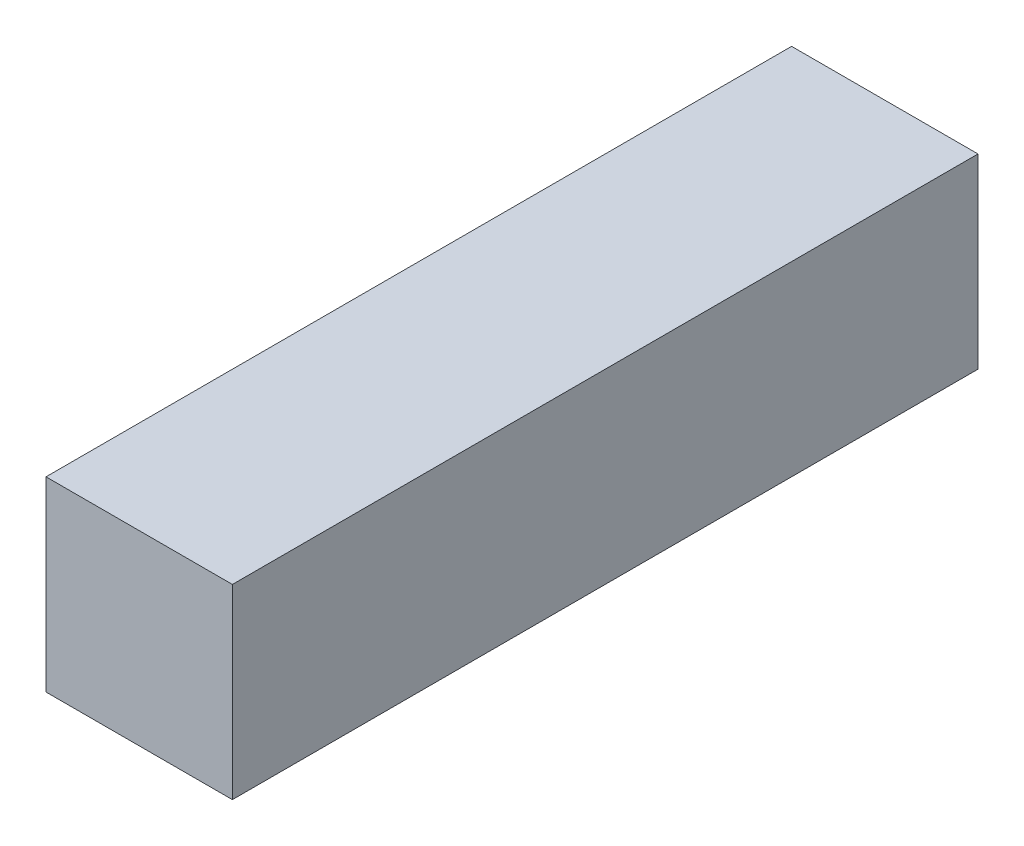
ISO-10303-21;
HEADER;
FILE_DESCRIPTION(('STEP AP214'),'2;1');
FILE_NAME('part.step','',(''),(''),'','','');
FILE_SCHEMA(('AUTOMOTIVE_DESIGN { 1 0 10303 214 1 1 1 1 }'));
ENDSEC;
DATA;
#1=APPLICATION_CONTEXT('core data for automotive mechanical design processes');
#2=APPLICATION_PROTOCOL_DEFINITION('international standard','automotive_design',2000,#1);
#3=PRODUCT_CONTEXT('',#1,'mechanical');
#4=PRODUCT('Part','Part','',(#3));
#5=PRODUCT_RELATED_PRODUCT_CATEGORY('part','',(#4));
#6=PRODUCT_DEFINITION_FORMATION('','',#4);
#7=PRODUCT_DEFINITION_CONTEXT('part definition',#1,'design');
#8=PRODUCT_DEFINITION('design','',#6,#7);
#9=PRODUCT_DEFINITION_SHAPE('','',#8);
#10=(LENGTH_UNIT() NAMED_UNIT(*) SI_UNIT(.MILLI.,.METRE.));
#11=(NAMED_UNIT(*) PLANE_ANGLE_UNIT() SI_UNIT($,.RADIAN.));
#12=(NAMED_UNIT(*) SI_UNIT($,.STERADIAN.) SOLID_ANGLE_UNIT());
#13=UNCERTAINTY_MEASURE_WITH_UNIT(LENGTH_MEASURE(1.E-05),#10,'distance_accuracy_value','');
#14=(GEOMETRIC_REPRESENTATION_CONTEXT(3) GLOBAL_UNCERTAINTY_ASSIGNED_CONTEXT((#13)) GLOBAL_UNIT_ASSIGNED_CONTEXT((#10,
#11,#12)) REPRESENTATION_CONTEXT('',''));
#15=CARTESIAN_POINT('',(0.,0.,0.));
#16=DIRECTION('',(0.,0.,1.));
#17=DIRECTION('',(1.,0.,0.));
#18=AXIS2_PLACEMENT_3D('',#15,#16,#17);
#19=CARTESIAN_POINT('',(-1.74999999999947,1.24999999999942,12.));
#20=DIRECTION('',(0.,-1.,0.));
#21=DIRECTION('',(0.,0.,-1.));
#22=AXIS2_PLACEMENT_3D('',#19,#20,#21);
#23=PLANE('',#22);
#24=DIRECTION('',(-1.,0.,0.));
#25=VECTOR('',#24,1.);
#26=CARTESIAN_POINT('',(-1.74999999999947,1.24999999999942,0.));
#27=LINE('',#26,#25);
#28=CARTESIAN_POINT('',(-1.74999999999947,1.24999999999942,0.));
#29=VERTEX_POINT('',#28);
#30=CARTESIAN_POINT('',(-4.74999999999947,1.24999999999942,0.));
#31=VERTEX_POINT('',#30);
#32=EDGE_CURVE('E96',#29,#31,#27,.T.);
#33=ORIENTED_EDGE('',*,*,#32,.T.);
#34=DIRECTION('',(0.,0.,-1.));
#35=VECTOR('',#34,1.);
#36=CARTESIAN_POINT('',(-4.74999999999947,1.24999999999942,12.));
#37=LINE('',#36,#35);
#38=CARTESIAN_POINT('',(-4.74999999999947,1.24999999999942,12.));
#39=VERTEX_POINT('',#38);
#40=EDGE_CURVE('E11',#39,#31,#37,.T.);
#41=ORIENTED_EDGE('',*,*,#40,.F.);
#42=DIRECTION('',(-1.,0.,0.));
#43=VECTOR('',#42,1.);
#44=CARTESIAN_POINT('',(-1.74999999999947,1.24999999999942,12.));
#45=LINE('',#44,#43);
#46=CARTESIAN_POINT('',(-1.74999999999947,1.24999999999942,12.));
#47=VERTEX_POINT('',#46);
#48=EDGE_CURVE('E84',#47,#39,#45,.T.);
#49=ORIENTED_EDGE('',*,*,#48,.F.);
#50=DIRECTION('',(0.,0.,-1.));
#51=VECTOR('',#50,1.);
#52=CARTESIAN_POINT('',(-1.74999999999947,1.24999999999942,12.));
#53=LINE('',#52,#51);
#54=EDGE_CURVE('E92',#47,#29,#53,.T.);
#55=ORIENTED_EDGE('',*,*,#54,.T.);
#56=EDGE_LOOP('',(#33,#41,#49,#55));
#57=FACE_BOUND('',#56,.T.);
#58=ADVANCED_FACE('F33',(#57),#23,.F.);
#59=CARTESIAN_POINT('',(-4.74999999999947,1.24999999999942,12.));
#60=DIRECTION('',(1.,0.,0.));
#61=DIRECTION('',(0.,0.,-1.));
#62=AXIS2_PLACEMENT_3D('',#59,#60,#61);
#63=PLANE('',#62);
#64=DIRECTION('',(0.,-1.,0.));
#65=VECTOR('',#64,1.);
#66=CARTESIAN_POINT('',(-4.74999999999947,1.24999999999942,0.));
#67=LINE('',#66,#65);
#68=CARTESIAN_POINT('',(-4.74999999999947,-1.75000000000058,0.));
#69=VERTEX_POINT('',#68);
#70=EDGE_CURVE('E88',#31,#69,#67,.T.);
#71=ORIENTED_EDGE('',*,*,#70,.T.);
#72=DIRECTION('',(0.,0.,-1.));
#73=VECTOR('',#72,1.);
#74=CARTESIAN_POINT('',(-4.74999999999947,-1.75000000000058,12.));
#75=LINE('',#74,#73);
#76=CARTESIAN_POINT('',(-4.74999999999947,-1.75000000000058,12.));
#77=VERTEX_POINT('',#76);
#78=EDGE_CURVE('E41',#77,#69,#75,.T.);
#79=ORIENTED_EDGE('',*,*,#78,.F.);
#80=DIRECTION('',(0.,-1.,0.));
#81=VECTOR('',#80,1.);
#82=CARTESIAN_POINT('',(-4.74999999999947,1.24999999999942,12.));
#83=LINE('',#82,#81);
#84=EDGE_CURVE('E79',#39,#77,#83,.T.);
#85=ORIENTED_EDGE('',*,*,#84,.F.);
#86=ORIENTED_EDGE('',*,*,#40,.T.);
#87=EDGE_LOOP('',(#71,#79,#85,#86));
#88=FACE_BOUND('',#87,.T.);
#89=ADVANCED_FACE('F87',(#88),#63,.F.);
#90=CARTESIAN_POINT('',(-4.74999999999947,-1.75000000000058,12.));
#91=DIRECTION('',(0.,1.,0.));
#92=DIRECTION('',(0.,0.,1.));
#93=AXIS2_PLACEMENT_3D('',#90,#91,#92);
#94=PLANE('',#93);
#95=DIRECTION('',(1.,0.,0.));
#96=VECTOR('',#95,1.);
#97=CARTESIAN_POINT('',(-4.74999999999947,-1.75000000000058,0.));
#98=LINE('',#97,#96);
#99=CARTESIAN_POINT('',(-1.74999999999947,-1.75000000000058,0.));
#100=VERTEX_POINT('',#99);
#101=EDGE_CURVE('E66',#69,#100,#98,.T.);
#102=ORIENTED_EDGE('',*,*,#101,.T.);
#103=DIRECTION('',(0.,0.,-1.));
#104=VECTOR('',#103,1.);
#105=CARTESIAN_POINT('',(-1.74999999999947,-1.75000000000058,12.));
#106=LINE('',#105,#104);
#107=CARTESIAN_POINT('',(-1.74999999999947,-1.75000000000058,12.));
#108=VERTEX_POINT('',#107);
#109=EDGE_CURVE('E89',#108,#100,#106,.T.);
#110=ORIENTED_EDGE('',*,*,#109,.F.);
#111=DIRECTION('',(1.,0.,0.));
#112=VECTOR('',#111,1.);
#113=CARTESIAN_POINT('',(-4.74999999999947,-1.75000000000058,12.));
#114=LINE('',#113,#112);
#115=EDGE_CURVE('E82',#77,#108,#114,.T.);
#116=ORIENTED_EDGE('',*,*,#115,.F.);
#117=ORIENTED_EDGE('',*,*,#78,.T.);
#118=EDGE_LOOP('',(#102,#110,#116,#117));
#119=FACE_BOUND('',#118,.T.);
#120=ADVANCED_FACE('F90',(#119),#94,.F.);
#121=CARTESIAN_POINT('',(-1.74999999999947,-1.75000000000058,12.));
#122=DIRECTION('',(-1.,0.,0.));
#123=DIRECTION('',(0.,0.,1.));
#124=AXIS2_PLACEMENT_3D('',#121,#122,#123);
#125=PLANE('',#124);
#126=DIRECTION('',(0.,1.,0.));
#127=VECTOR('',#126,1.);
#128=CARTESIAN_POINT('',(-1.74999999999947,-1.75000000000058,0.));
#129=LINE('',#128,#127);
#130=EDGE_CURVE('E72',#100,#29,#129,.T.);
#131=ORIENTED_EDGE('',*,*,#130,.T.);
#132=ORIENTED_EDGE('',*,*,#54,.F.);
#133=DIRECTION('',(0.,1.,0.));
#134=VECTOR('',#133,1.);
#135=CARTESIAN_POINT('',(-1.74999999999947,-1.75000000000058,12.));
#136=LINE('',#135,#134);
#137=EDGE_CURVE('E49',#108,#47,#136,.T.);
#138=ORIENTED_EDGE('',*,*,#137,.F.);
#139=ORIENTED_EDGE('',*,*,#109,.T.);
#140=EDGE_LOOP('',(#131,#132,#138,#139));
#141=FACE_BOUND('',#140,.T.);
#142=ADVANCED_FACE('F103',(#141),#125,.F.);
#143=CARTESIAN_POINT('',(0.,0.,12.));
#144=DIRECTION('',(0.,0.,1.));
#145=DIRECTION('',(1.,0.,0.));
#146=AXIS2_PLACEMENT_3D('',#143,#144,#145);
#147=PLANE('',#146);
#148=ORIENTED_EDGE('',*,*,#48,.T.);
#149=ORIENTED_EDGE('',*,*,#84,.T.);
#150=ORIENTED_EDGE('',*,*,#115,.T.);
#151=ORIENTED_EDGE('',*,*,#137,.T.);
#152=EDGE_LOOP('',(#148,#149,#150,#151));
#153=FACE_BOUND('',#152,.T.);
#154=ADVANCED_FACE('F80',(#153),#147,.T.);
#155=CARTESIAN_POINT('',(0.,0.,0.));
#156=DIRECTION('',(0.,0.,1.));
#157=DIRECTION('',(1.,0.,0.));
#158=AXIS2_PLACEMENT_3D('',#155,#156,#157);
#159=PLANE('',#158);
#160=ORIENTED_EDGE('',*,*,#32,.F.);
#161=ORIENTED_EDGE('',*,*,#130,.F.);
#162=ORIENTED_EDGE('',*,*,#101,.F.);
#163=ORIENTED_EDGE('',*,*,#70,.F.);
#164=EDGE_LOOP('',(#160,#161,#162,#163));
#165=FACE_BOUND('',#164,.T.);
#166=ADVANCED_FACE('F106',(#165),#159,.F.);
#167=CLOSED_SHELL('',(#58,#89,#120,#142,#154,#166));
#168=MANIFOLD_SOLID_BREP('B2',#167);
#169=ADVANCED_BREP_SHAPE_REPRESENTATION('',(#18,#168),#14);
#170=SHAPE_DEFINITION_REPRESENTATION(#9,#169);
ENDSEC;
END-ISO-10303-21;
